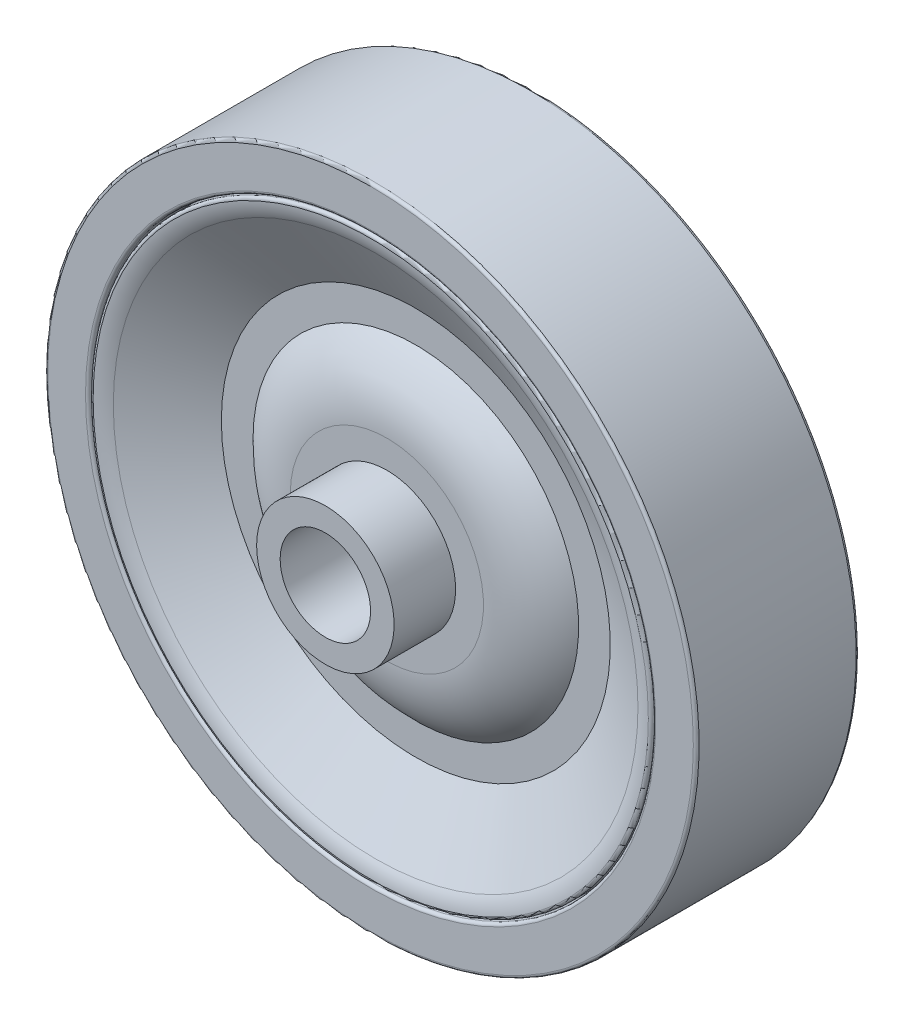
ISO-10303-21;
HEADER;
FILE_DESCRIPTION(('STEP AP214'),'2;1');
FILE_NAME('part.step','',(''),(''),'','','');
FILE_SCHEMA(('AUTOMOTIVE_DESIGN { 1 0 10303 214 1 1 1 1 }'));
ENDSEC;
DATA;
#1=APPLICATION_CONTEXT('core data for automotive mechanical design processes');
#2=APPLICATION_PROTOCOL_DEFINITION('international standard','automotive_design',2000,#1);
#3=PRODUCT_CONTEXT('',#1,'mechanical');
#4=PRODUCT('Part','Part','',(#3));
#5=PRODUCT_RELATED_PRODUCT_CATEGORY('part','',(#4));
#6=PRODUCT_DEFINITION_FORMATION('','',#4);
#7=PRODUCT_DEFINITION_CONTEXT('part definition',#1,'design');
#8=PRODUCT_DEFINITION('design','',#6,#7);
#9=PRODUCT_DEFINITION_SHAPE('','',#8);
#10=(LENGTH_UNIT() NAMED_UNIT(*) SI_UNIT(.MILLI.,.METRE.));
#11=(NAMED_UNIT(*) PLANE_ANGLE_UNIT() SI_UNIT($,.RADIAN.));
#12=(NAMED_UNIT(*) SI_UNIT($,.STERADIAN.) SOLID_ANGLE_UNIT());
#13=UNCERTAINTY_MEASURE_WITH_UNIT(LENGTH_MEASURE(1.E-05),#10,'distance_accuracy_value','');
#14=(GEOMETRIC_REPRESENTATION_CONTEXT(3) GLOBAL_UNCERTAINTY_ASSIGNED_CONTEXT((#13)) GLOBAL_UNIT_ASSIGNED_CONTEXT((#10,
#11,#12)) REPRESENTATION_CONTEXT('',''));
#15=CARTESIAN_POINT('',(0.,0.,0.));
#16=DIRECTION('',(0.,0.,1.));
#17=DIRECTION('',(1.,0.,0.));
#18=AXIS2_PLACEMENT_3D('',#15,#16,#17);
#19=CARTESIAN_POINT('',(0.,0.,-11.1125));
#20=DIRECTION('',(0.,0.,-1.));
#21=DIRECTION('',(-1.,0.,0.));
#22=AXIS2_PLACEMENT_3D('',#19,#20,#21);
#23=CYLINDRICAL_SURFACE('',#22,24.638);
#24=CARTESIAN_POINT('',(0.,0.,-6.87868556629696));
#25=DIRECTION('',(0.,0.,1.));
#26=DIRECTION('',(1.,0.,0.));
#27=AXIS2_PLACEMENT_3D('',#24,#25,#26);
#28=CIRCLE('',#27,24.638);
#29=CARTESIAN_POINT('',(24.638,0.,-6.87868556629696));
#30=VERTEX_POINT('',#29);
#31=EDGE_CURVE('E161',#30,#30,#28,.T.);
#32=ORIENTED_EDGE('',*,*,#31,.T.);
#33=EDGE_LOOP('',(#32));
#34=FACE_BOUND('',#33,.T.);
#35=CARTESIAN_POINT('',(0.,0.,6.87868556629696));
#36=DIRECTION('',(0.,0.,1.));
#37=DIRECTION('',(1.,0.,0.));
#38=AXIS2_PLACEMENT_3D('',#35,#36,#37);
#39=CIRCLE('',#38,24.638);
#40=CARTESIAN_POINT('',(24.638,0.,6.87868556629696));
#41=VERTEX_POINT('',#40);
#42=EDGE_CURVE('E55',#41,#41,#39,.T.);
#43=ORIENTED_EDGE('',*,*,#42,.F.);
#44=EDGE_LOOP('',(#43));
#45=FACE_BOUND('',#44,.T.);
#46=ADVANCED_FACE('F47',(#34,#45),#23,.T.);
#47=CARTESIAN_POINT('',(0.,0.,-3.96875));
#48=DIRECTION('',(0.,0.,-1.));
#49=DIRECTION('',(-1.,0.,0.));
#50=AXIS2_PLACEMENT_3D('',#47,#48,#49);
#51=TOROIDAL_SURFACE('',#50,24.638,3.175);
#52=CARTESIAN_POINT('',(0.,0.,-7.131723441629));
#53=DIRECTION('',(0.,0.,1.));
#54=DIRECTION('',(1.,0.,0.));
#55=AXIS2_PLACEMENT_3D('',#52,#53,#54);
#56=CIRCLE('',#55,24.3619130434781);
#57=CARTESIAN_POINT('',(24.3619130434781,0.,-7.131723441629));
#58=VERTEX_POINT('',#57);
#59=EDGE_CURVE('E158',#58,#58,#56,.F.);
#60=ORIENTED_EDGE('',*,*,#59,.T.);
#61=EDGE_LOOP('',(#60));
#62=FACE_BOUND('',#61,.T.);
#63=CARTESIAN_POINT('',(0.,0.,-6.70077389814638));
#64=DIRECTION('',(0.,0.,-1.));
#65=DIRECTION('',(-1.,0.,0.));
#66=AXIS2_PLACEMENT_3D('',#63,#64,#65);
#67=CIRCLE('',#66,23.0203874320601);
#68=CARTESIAN_POINT('',(-23.0203874320601,0.,-6.70077389814638));
#69=VERTEX_POINT('',#68);
#70=EDGE_CURVE('E155',#69,#69,#67,.T.);
#71=ORIENTED_EDGE('',*,*,#70,.F.);
#72=EDGE_LOOP('',(#71));
#73=FACE_BOUND('',#72,.T.);
#74=ADVANCED_FACE('F105',(#62,#73),#51,.T.);
#75=CARTESIAN_POINT('',(0.,0.,-3.17499999999999));
#76=DIRECTION('',(0.,0.,-1.));
#77=DIRECTION('',(-1.,0.,0.));
#78=AXIS2_PLACEMENT_3D('',#75,#76,#77);
#79=CONICAL_SURFACE('',#78,17.065625,1.03621099057237);
#80=ORIENTED_EDGE('',*,*,#70,.T.);
#81=EDGE_LOOP('',(#80));
#82=FACE_BOUND('',#81,.T.);
#83=CARTESIAN_POINT('',(0.,0.,-3.17499999999999));
#84=DIRECTION('',(0.,0.,-1.));
#85=DIRECTION('',(-1.,0.,0.));
#86=AXIS2_PLACEMENT_3D('',#83,#84,#85);
#87=CIRCLE('',#86,17.065625);
#88=CARTESIAN_POINT('',(-17.065625,0.,-3.17499999999999));
#89=VERTEX_POINT('',#88);
#90=EDGE_CURVE('E152',#89,#89,#87,.T.);
#91=ORIENTED_EDGE('',*,*,#90,.F.);
#92=EDGE_LOOP('',(#91));
#93=FACE_BOUND('',#92,.T.);
#94=ADVANCED_FACE('F111',(#82,#93),#79,.F.);
#95=CARTESIAN_POINT('',(0.,-14.2875,-3.17499999999999));
#96=DIRECTION('',(0.,0.,-1.));
#97=DIRECTION('',(-1.,0.,0.));
#98=AXIS2_PLACEMENT_3D('',#95,#96,#97);
#99=PLANE('',#98);
#100=ORIENTED_EDGE('',*,*,#90,.T.);
#101=EDGE_LOOP('',(#100));
#102=FACE_BOUND('',#101,.T.);
#103=CARTESIAN_POINT('',(0.,0.,-3.17499999999999));
#104=DIRECTION('',(0.,0.,-1.));
#105=DIRECTION('',(-1.,0.,0.));
#106=AXIS2_PLACEMENT_3D('',#103,#104,#105);
#107=CIRCLE('',#106,14.2875);
#108=CARTESIAN_POINT('',(-14.2875,0.,-3.17499999999999));
#109=VERTEX_POINT('',#108);
#110=EDGE_CURVE('E149',#109,#109,#107,.T.);
#111=ORIENTED_EDGE('',*,*,#110,.F.);
#112=EDGE_LOOP('',(#111));
#113=FACE_BOUND('',#112,.T.);
#114=ADVANCED_FACE('F119',(#102,#113),#99,.T.);
#115=CARTESIAN_POINT('',(0.,0.,2.20343118058775));
#116=DIRECTION('',(0.,0.,-1.));
#117=DIRECTION('',(-1.,0.,0.));
#118=AXIS2_PLACEMENT_3D('',#115,#116,#117);
#119=TOROIDAL_SURFACE('',#118,8.47595714139644,7.91843118058775);
#120=ORIENTED_EDGE('',*,*,#110,.T.);
#121=EDGE_LOOP('',(#120));
#122=FACE_BOUND('',#121,.T.);
#123=CARTESIAN_POINT('',(0.,0.,-5.715));
#124=DIRECTION('',(0.,0.,-1.));
#125=DIRECTION('',(-1.,0.,0.));
#126=AXIS2_PLACEMENT_3D('',#123,#124,#125);
#127=CIRCLE('',#126,8.47595714139644);
#128=CARTESIAN_POINT('',(-8.47595714139644,0.,-5.715));
#129=VERTEX_POINT('',#128);
#130=EDGE_CURVE('E144',#129,#129,#127,.T.);
#131=ORIENTED_EDGE('',*,*,#130,.F.);
#132=EDGE_LOOP('',(#131));
#133=FACE_BOUND('',#132,.T.);
#134=ADVANCED_FACE('F123',(#122,#133),#119,.T.);
#135=CARTESIAN_POINT('',(0.,-8.47595714139645,-5.715));
#136=DIRECTION('',(0.,0.,-1.));
#137=DIRECTION('',(-1.,0.,0.));
#138=AXIS2_PLACEMENT_3D('',#135,#136,#137);
#139=PLANE('',#138);
#140=ORIENTED_EDGE('',*,*,#130,.T.);
#141=EDGE_LOOP('',(#140));
#142=FACE_BOUND('',#141,.T.);
#143=CARTESIAN_POINT('',(0.,0.,-5.715));
#144=DIRECTION('',(0.,0.,-1.));
#145=DIRECTION('',(-1.,0.,0.));
#146=AXIS2_PLACEMENT_3D('',#143,#144,#145);
#147=CIRCLE('',#146,6.0325);
#148=CARTESIAN_POINT('',(-6.0325,0.,-5.715));
#149=VERTEX_POINT('',#148);
#150=EDGE_CURVE('E139',#149,#149,#147,.T.);
#151=ORIENTED_EDGE('',*,*,#150,.F.);
#152=EDGE_LOOP('',(#151));
#153=FACE_BOUND('',#152,.T.);
#154=ADVANCED_FACE('F127',(#142,#153),#139,.T.);
#155=CARTESIAN_POINT('',(0.,0.,-11.1125));
#156=DIRECTION('',(0.,0.,-1.));
#157=DIRECTION('',(-1.,0.,0.));
#158=AXIS2_PLACEMENT_3D('',#155,#156,#157);
#159=CYLINDRICAL_SURFACE('',#158,6.0325);
#160=ORIENTED_EDGE('',*,*,#150,.T.);
#161=EDGE_LOOP('',(#160));
#162=FACE_BOUND('',#161,.T.);
#163=CARTESIAN_POINT('',(0.,0.,-11.1125));
#164=DIRECTION('',(0.,0.,-1.));
#165=DIRECTION('',(-1.,0.,0.));
#166=AXIS2_PLACEMENT_3D('',#163,#164,#165);
#167=CIRCLE('',#166,6.0325);
#168=CARTESIAN_POINT('',(-6.0325,0.,-11.1125));
#169=VERTEX_POINT('',#168);
#170=EDGE_CURVE('E142',#169,#169,#167,.T.);
#171=ORIENTED_EDGE('',*,*,#170,.F.);
#172=EDGE_LOOP('',(#171));
#173=FACE_BOUND('',#172,.T.);
#174=ADVANCED_FACE('F99',(#162,#173),#159,.T.);
#175=CARTESIAN_POINT('',(0.,-3.96875,-11.1125));
#176=DIRECTION('',(0.,0.,-1.));
#177=DIRECTION('',(-1.,0.,0.));
#178=AXIS2_PLACEMENT_3D('',#175,#176,#177);
#179=PLANE('',#178);
#180=ORIENTED_EDGE('',*,*,#170,.T.);
#181=EDGE_LOOP('',(#180));
#182=FACE_BOUND('',#181,.T.);
#183=CARTESIAN_POINT('',(0.,0.,-11.1125));
#184=DIRECTION('',(0.,0.,-1.));
#185=DIRECTION('',(-1.,0.,0.));
#186=AXIS2_PLACEMENT_3D('',#183,#184,#185);
#187=CIRCLE('',#186,3.96875);
#188=CARTESIAN_POINT('',(-3.96875,0.,-11.1125));
#189=VERTEX_POINT('',#188);
#190=EDGE_CURVE('E67',#189,#189,#187,.T.);
#191=ORIENTED_EDGE('',*,*,#190,.F.);
#192=EDGE_LOOP('',(#191));
#193=FACE_BOUND('',#192,.T.);
#194=ADVANCED_FACE('F89',(#182,#193),#179,.T.);
#195=CARTESIAN_POINT('',(0.,0.,-11.1125));
#196=DIRECTION('',(0.,0.,-1.));
#197=DIRECTION('',(-1.,0.,0.));
#198=AXIS2_PLACEMENT_3D('',#195,#196,#197);
#199=CYLINDRICAL_SURFACE('',#198,3.96875);
#200=ORIENTED_EDGE('',*,*,#190,.T.);
#201=EDGE_LOOP('',(#200));
#202=FACE_BOUND('',#201,.T.);
#203=CARTESIAN_POINT('',(0.,0.,11.1125));
#204=DIRECTION('',(0.,0.,-1.));
#205=DIRECTION('',(-1.,0.,0.));
#206=AXIS2_PLACEMENT_3D('',#203,#204,#205);
#207=CIRCLE('',#206,3.96875);
#208=CARTESIAN_POINT('',(-3.96875,0.,11.1125));
#209=VERTEX_POINT('',#208);
#210=EDGE_CURVE('E51',#209,#209,#207,.T.);
#211=ORIENTED_EDGE('',*,*,#210,.F.);
#212=EDGE_LOOP('',(#211));
#213=FACE_BOUND('',#212,.T.);
#214=ADVANCED_FACE('F86',(#202,#213),#199,.F.);
#215=CARTESIAN_POINT('',(0.,0.,-6.87868556629696));
#216=DIRECTION('',(0.,0.,1.));
#217=DIRECTION('',(1.,0.,0.));
#218=AXIS2_PLACEMENT_3D('',#215,#216,#217);
#219=TOROIDAL_SURFACE('',#218,24.384,0.254);
#220=ORIENTED_EDGE('',*,*,#31,.F.);
#221=EDGE_LOOP('',(#220));
#222=FACE_BOUND('',#221,.T.);
#223=ORIENTED_EDGE('',*,*,#59,.F.);
#224=EDGE_LOOP('',(#223));
#225=FACE_BOUND('',#224,.T.);
#226=ADVANCED_FACE('F88',(#222,#225),#219,.T.);
#227=CARTESIAN_POINT('',(0.,0.,3.96875));
#228=DIRECTION('',(0.,0.,1.));
#229=DIRECTION('',(-1.,0.,0.));
#230=AXIS2_PLACEMENT_3D('',#227,#228,#229);
#231=TOROIDAL_SURFACE('',#230,24.638,3.175);
#232=CARTESIAN_POINT('',(0.,0.,7.131723441629));
#233=DIRECTION('',(0.,0.,1.));
#234=DIRECTION('',(1.,0.,0.));
#235=AXIS2_PLACEMENT_3D('',#232,#233,#234);
#236=CIRCLE('',#235,24.3619130434781);
#237=CARTESIAN_POINT('',(24.3619130434781,0.,7.131723441629));
#238=VERTEX_POINT('',#237);
#239=EDGE_CURVE('E11',#238,#238,#236,.F.);
#240=ORIENTED_EDGE('',*,*,#239,.F.);
#241=EDGE_LOOP('',(#240));
#242=FACE_BOUND('',#241,.T.);
#243=CARTESIAN_POINT('',(0.,0.,6.70077389814638));
#244=DIRECTION('',(0.,0.,-1.));
#245=DIRECTION('',(-1.,0.,0.));
#246=AXIS2_PLACEMENT_3D('',#243,#244,#245);
#247=CIRCLE('',#246,23.0203874320601);
#248=CARTESIAN_POINT('',(-23.0203874320601,0.,6.70077389814638));
#249=VERTEX_POINT('',#248);
#250=EDGE_CURVE('E63',#249,#249,#247,.T.);
#251=ORIENTED_EDGE('',*,*,#250,.T.);
#252=EDGE_LOOP('',(#251));
#253=FACE_BOUND('',#252,.T.);
#254=ADVANCED_FACE('F96',(#242,#253),#231,.T.);
#255=CARTESIAN_POINT('',(0.,0.,3.17499999999999));
#256=DIRECTION('',(0.,0.,1.));
#257=DIRECTION('',(-1.,0.,0.));
#258=AXIS2_PLACEMENT_3D('',#255,#256,#257);
#259=CONICAL_SURFACE('',#258,17.065625,1.03621099057237);
#260=ORIENTED_EDGE('',*,*,#250,.F.);
#261=EDGE_LOOP('',(#260));
#262=FACE_BOUND('',#261,.T.);
#263=CARTESIAN_POINT('',(0.,0.,3.17499999999999));
#264=DIRECTION('',(0.,0.,-1.));
#265=DIRECTION('',(-1.,0.,0.));
#266=AXIS2_PLACEMENT_3D('',#263,#264,#265);
#267=CIRCLE('',#266,17.065625);
#268=CARTESIAN_POINT('',(-17.065625,0.,3.17499999999999));
#269=VERTEX_POINT('',#268);
#270=EDGE_CURVE('E66',#269,#269,#267,.T.);
#271=ORIENTED_EDGE('',*,*,#270,.T.);
#272=EDGE_LOOP('',(#271));
#273=FACE_BOUND('',#272,.T.);
#274=ADVANCED_FACE('F198',(#262,#273),#259,.F.);
#275=CARTESIAN_POINT('',(0.,-14.2875,3.17499999999999));
#276=DIRECTION('',(0.,0.,1.));
#277=DIRECTION('',(-1.,0.,0.));
#278=AXIS2_PLACEMENT_3D('',#275,#276,#277);
#279=PLANE('',#278);
#280=ORIENTED_EDGE('',*,*,#270,.F.);
#281=EDGE_LOOP('',(#280));
#282=FACE_BOUND('',#281,.T.);
#283=CARTESIAN_POINT('',(0.,0.,3.17499999999999));
#284=DIRECTION('',(0.,0.,-1.));
#285=DIRECTION('',(-1.,0.,0.));
#286=AXIS2_PLACEMENT_3D('',#283,#284,#285);
#287=CIRCLE('',#286,14.2875);
#288=CARTESIAN_POINT('',(-14.2875,0.,3.17499999999999));
#289=VERTEX_POINT('',#288);
#290=EDGE_CURVE('E70',#289,#289,#287,.T.);
#291=ORIENTED_EDGE('',*,*,#290,.T.);
#292=EDGE_LOOP('',(#291));
#293=FACE_BOUND('',#292,.T.);
#294=ADVANCED_FACE('F206',(#282,#293),#279,.T.);
#295=CARTESIAN_POINT('',(0.,0.,-2.20343118058775));
#296=DIRECTION('',(0.,0.,1.));
#297=DIRECTION('',(-1.,0.,0.));
#298=AXIS2_PLACEMENT_3D('',#295,#296,#297);
#299=TOROIDAL_SURFACE('',#298,8.47595714139644,7.91843118058775);
#300=ORIENTED_EDGE('',*,*,#290,.F.);
#301=EDGE_LOOP('',(#300));
#302=FACE_BOUND('',#301,.T.);
#303=CARTESIAN_POINT('',(0.,0.,5.715));
#304=DIRECTION('',(0.,0.,-1.));
#305=DIRECTION('',(-1.,0.,0.));
#306=AXIS2_PLACEMENT_3D('',#303,#304,#305);
#307=CIRCLE('',#306,8.47595714139644);
#308=CARTESIAN_POINT('',(-8.47595714139644,0.,5.715));
#309=VERTEX_POINT('',#308);
#310=EDGE_CURVE('E73',#309,#309,#307,.T.);
#311=ORIENTED_EDGE('',*,*,#310,.T.);
#312=EDGE_LOOP('',(#311));
#313=FACE_BOUND('',#312,.T.);
#314=ADVANCED_FACE('F214',(#302,#313),#299,.T.);
#315=CARTESIAN_POINT('',(0.,-8.47595714139645,5.715));
#316=DIRECTION('',(0.,0.,1.));
#317=DIRECTION('',(-1.,0.,0.));
#318=AXIS2_PLACEMENT_3D('',#315,#316,#317);
#319=PLANE('',#318);
#320=ORIENTED_EDGE('',*,*,#310,.F.);
#321=EDGE_LOOP('',(#320));
#322=FACE_BOUND('',#321,.T.);
#323=CARTESIAN_POINT('',(0.,0.,5.715));
#324=DIRECTION('',(0.,0.,-1.));
#325=DIRECTION('',(-1.,0.,0.));
#326=AXIS2_PLACEMENT_3D('',#323,#324,#325);
#327=CIRCLE('',#326,6.0325);
#328=CARTESIAN_POINT('',(-6.0325,0.,5.715));
#329=VERTEX_POINT('',#328);
#330=EDGE_CURVE('E76',#329,#329,#327,.T.);
#331=ORIENTED_EDGE('',*,*,#330,.T.);
#332=EDGE_LOOP('',(#331));
#333=FACE_BOUND('',#332,.T.);
#334=ADVANCED_FACE('F222',(#322,#333),#319,.T.);
#335=CARTESIAN_POINT('',(0.,0.,11.1125));
#336=DIRECTION('',(0.,0.,1.));
#337=DIRECTION('',(-1.,0.,0.));
#338=AXIS2_PLACEMENT_3D('',#335,#336,#337);
#339=CYLINDRICAL_SURFACE('',#338,6.0325);
#340=ORIENTED_EDGE('',*,*,#330,.F.);
#341=EDGE_LOOP('',(#340));
#342=FACE_BOUND('',#341,.T.);
#343=CARTESIAN_POINT('',(0.,0.,11.1125));
#344=DIRECTION('',(0.,0.,-1.));
#345=DIRECTION('',(-1.,0.,0.));
#346=AXIS2_PLACEMENT_3D('',#343,#344,#345);
#347=CIRCLE('',#346,6.0325);
#348=CARTESIAN_POINT('',(-6.0325,0.,11.1125));
#349=VERTEX_POINT('',#348);
#350=EDGE_CURVE('E78',#349,#349,#347,.T.);
#351=ORIENTED_EDGE('',*,*,#350,.T.);
#352=EDGE_LOOP('',(#351));
#353=FACE_BOUND('',#352,.T.);
#354=ADVANCED_FACE('F230',(#342,#353),#339,.T.);
#355=CARTESIAN_POINT('',(0.,-3.96875,11.1125));
#356=DIRECTION('',(0.,0.,1.));
#357=DIRECTION('',(-1.,0.,0.));
#358=AXIS2_PLACEMENT_3D('',#355,#356,#357);
#359=PLANE('',#358);
#360=ORIENTED_EDGE('',*,*,#350,.F.);
#361=EDGE_LOOP('',(#360));
#362=FACE_BOUND('',#361,.T.);
#363=ORIENTED_EDGE('',*,*,#210,.T.);
#364=EDGE_LOOP('',(#363));
#365=FACE_BOUND('',#364,.T.);
#366=ADVANCED_FACE('F49',(#362,#365),#359,.T.);
#367=CARTESIAN_POINT('',(0.,0.,6.87868556629696));
#368=DIRECTION('',(0.,0.,-1.));
#369=DIRECTION('',(1.,0.,0.));
#370=AXIS2_PLACEMENT_3D('',#367,#368,#369);
#371=TOROIDAL_SURFACE('',#370,24.384,0.254);
#372=ORIENTED_EDGE('',*,*,#42,.T.);
#373=EDGE_LOOP('',(#372));
#374=FACE_BOUND('',#373,.T.);
#375=ORIENTED_EDGE('',*,*,#239,.T.);
#376=EDGE_LOOP('',(#375));
#377=FACE_BOUND('',#376,.T.);
#378=ADVANCED_FACE('F244',(#374,#377),#371,.T.);
#379=CLOSED_SHELL('',(#46,#74,#94,#114,#134,#154,#174,#194,#214,#226,#254,#274,#294,#314,#334,
#354,#366,#378));
#380=MANIFOLD_SOLID_BREP('B2',#379);
#381=CARTESIAN_POINT('',(0.,0.,-6.88975));
#382=DIRECTION('',(0.,0.,-1.));
#383=DIRECTION('',(-1.,0.,0.));
#384=AXIS2_PLACEMENT_3D('',#381,#382,#383);
#385=TOROIDAL_SURFACE('',#384,28.321,0.254);
#386=CARTESIAN_POINT('',(0.,0.,-6.88975));
#387=DIRECTION('',(0.,0.,-1.));
#388=DIRECTION('',(-1.,0.,0.));
#389=AXIS2_PLACEMENT_3D('',#386,#387,#388);
#390=CIRCLE('',#389,28.575);
#391=CARTESIAN_POINT('',(-28.575,0.,-6.88975));
#392=VERTEX_POINT('',#391);
#393=EDGE_CURVE('E299',#392,#392,#390,.F.);
#394=ORIENTED_EDGE('',*,*,#393,.F.);
#395=EDGE_LOOP('',(#394));
#396=FACE_BOUND('',#395,.T.);
#397=CARTESIAN_POINT('',(0.,0.,-7.14375));
#398=DIRECTION('',(0.,0.,-1.));
#399=DIRECTION('',(-1.,0.,0.));
#400=AXIS2_PLACEMENT_3D('',#397,#398,#399);
#401=CIRCLE('',#400,28.321);
#402=CARTESIAN_POINT('',(-28.321,0.,-7.14375));
#403=VERTEX_POINT('',#402);
#404=EDGE_CURVE('E303',#403,#403,#401,.T.);
#405=ORIENTED_EDGE('',*,*,#404,.F.);
#406=EDGE_LOOP('',(#405));
#407=FACE_BOUND('',#406,.T.);
#408=ADVANCED_FACE('F292',(#396,#407),#385,.T.);
#409=CARTESIAN_POINT('',(-1.99538158514885E-13,-28.575,-7.14375));
#410=DIRECTION('',(0.,0.,-1.));
#411=DIRECTION('',(-1.,0.,0.));
#412=AXIS2_PLACEMENT_3D('',#409,#410,#411);
#413=PLANE('',#412);
#414=ORIENTED_EDGE('',*,*,#404,.T.);
#415=EDGE_LOOP('',(#414));
#416=FACE_BOUND('',#415,.T.);
#417=CARTESIAN_POINT('',(0.,0.,-7.14375));
#418=DIRECTION('',(0.,0.,-1.));
#419=DIRECTION('',(-1.,0.,0.));
#420=AXIS2_PLACEMENT_3D('',#417,#418,#419);
#421=CIRCLE('',#420,25.019);
#422=CARTESIAN_POINT('',(-25.019,0.,-7.14375));
#423=VERTEX_POINT('',#422);
#424=EDGE_CURVE('E307',#423,#423,#421,.F.);
#425=ORIENTED_EDGE('',*,*,#424,.T.);
#426=EDGE_LOOP('',(#425));
#427=FACE_BOUND('',#426,.T.);
#428=ADVANCED_FACE('F344',(#416,#427),#413,.T.);
#429=CARTESIAN_POINT('',(0.,0.,-6.88975));
#430=DIRECTION('',(0.,0.,-1.));
#431=DIRECTION('',(-1.,0.,0.));
#432=AXIS2_PLACEMENT_3D('',#429,#430,#431);
#433=TOROIDAL_SURFACE('',#432,25.019,0.254);
#434=ORIENTED_EDGE('',*,*,#424,.F.);
#435=EDGE_LOOP('',(#434));
#436=FACE_BOUND('',#435,.T.);
#437=CARTESIAN_POINT('',(0.,0.,-6.88975));
#438=DIRECTION('',(0.,0.,-1.));
#439=DIRECTION('',(-1.,0.,0.));
#440=AXIS2_PLACEMENT_3D('',#437,#438,#439);
#441=CIRCLE('',#440,24.765);
#442=CARTESIAN_POINT('',(-24.765,0.,-6.88975));
#443=VERTEX_POINT('',#442);
#444=EDGE_CURVE('E46',#443,#443,#441,.T.);
#445=ORIENTED_EDGE('',*,*,#444,.F.);
#446=EDGE_LOOP('',(#445));
#447=FACE_BOUND('',#446,.T.);
#448=ADVANCED_FACE('F294',(#436,#447),#433,.T.);
#449=CARTESIAN_POINT('',(0.,0.,-11.1125));
#450=DIRECTION('',(0.,0.,-1.));
#451=DIRECTION('',(-1.,0.,0.));
#452=AXIS2_PLACEMENT_3D('',#449,#450,#451);
#453=CYLINDRICAL_SURFACE('',#452,24.765);
#454=ORIENTED_EDGE('',*,*,#444,.T.);
#455=EDGE_LOOP('',(#454));
#456=FACE_BOUND('',#455,.T.);
#457=CARTESIAN_POINT('',(0.,0.,6.88975));
#458=DIRECTION('',(0.,0.,-1.));
#459=DIRECTION('',(-1.,0.,0.));
#460=AXIS2_PLACEMENT_3D('',#457,#458,#459);
#461=CIRCLE('',#460,24.765);
#462=CARTESIAN_POINT('',(-24.765,0.,6.88975));
#463=VERTEX_POINT('',#462);
#464=EDGE_CURVE('E312',#463,#463,#461,.T.);
#465=ORIENTED_EDGE('',*,*,#464,.F.);
#466=EDGE_LOOP('',(#465));
#467=FACE_BOUND('',#466,.T.);
#468=ADVANCED_FACE('F355',(#456,#467),#453,.F.);
#469=CARTESIAN_POINT('',(0.,0.,-11.1125));
#470=DIRECTION('',(0.,0.,-1.));
#471=DIRECTION('',(-1.,0.,0.));
#472=AXIS2_PLACEMENT_3D('',#469,#470,#471);
#473=CYLINDRICAL_SURFACE('',#472,28.575);
#474=ORIENTED_EDGE('',*,*,#393,.T.);
#475=EDGE_LOOP('',(#474));
#476=FACE_BOUND('',#475,.T.);
#477=CARTESIAN_POINT('',(0.,0.,6.88975));
#478=DIRECTION('',(0.,0.,-1.));
#479=DIRECTION('',(-1.,0.,0.));
#480=AXIS2_PLACEMENT_3D('',#477,#478,#479);
#481=CIRCLE('',#480,28.575);
#482=CARTESIAN_POINT('',(-28.575,0.,6.88975));
#483=VERTEX_POINT('',#482);
#484=EDGE_CURVE('E315',#483,#483,#481,.F.);
#485=ORIENTED_EDGE('',*,*,#484,.F.);
#486=EDGE_LOOP('',(#485));
#487=FACE_BOUND('',#486,.T.);
#488=ADVANCED_FACE('F339',(#476,#487),#473,.T.);
#489=CARTESIAN_POINT('',(0.,0.,6.88975));
#490=DIRECTION('',(0.,0.,1.));
#491=DIRECTION('',(-1.,0.,0.));
#492=AXIS2_PLACEMENT_3D('',#489,#490,#491);
#493=TOROIDAL_SURFACE('',#492,28.321,0.254);
#494=ORIENTED_EDGE('',*,*,#484,.T.);
#495=EDGE_LOOP('',(#494));
#496=FACE_BOUND('',#495,.T.);
#497=CARTESIAN_POINT('',(0.,0.,7.14375));
#498=DIRECTION('',(0.,0.,-1.));
#499=DIRECTION('',(-1.,0.,0.));
#500=AXIS2_PLACEMENT_3D('',#497,#498,#499);
#501=CIRCLE('',#500,28.321);
#502=CARTESIAN_POINT('',(-28.321,0.,7.14375));
#503=VERTEX_POINT('',#502);
#504=EDGE_CURVE('E318',#503,#503,#501,.T.);
#505=ORIENTED_EDGE('',*,*,#504,.T.);
#506=EDGE_LOOP('',(#505));
#507=FACE_BOUND('',#506,.T.);
#508=ADVANCED_FACE('F330',(#496,#507),#493,.T.);
#509=CARTESIAN_POINT('',(-1.99538158514885E-13,-28.575,7.14375));
#510=DIRECTION('',(0.,0.,1.));
#511=DIRECTION('',(-1.,0.,0.));
#512=AXIS2_PLACEMENT_3D('',#509,#510,#511);
#513=PLANE('',#512);
#514=ORIENTED_EDGE('',*,*,#504,.F.);
#515=EDGE_LOOP('',(#514));
#516=FACE_BOUND('',#515,.T.);
#517=CARTESIAN_POINT('',(0.,0.,7.14375));
#518=DIRECTION('',(0.,0.,-1.));
#519=DIRECTION('',(-1.,0.,0.));
#520=AXIS2_PLACEMENT_3D('',#517,#518,#519);
#521=CIRCLE('',#520,25.019);
#522=CARTESIAN_POINT('',(-25.019,0.,7.14375));
#523=VERTEX_POINT('',#522);
#524=EDGE_CURVE('E321',#523,#523,#521,.F.);
#525=ORIENTED_EDGE('',*,*,#524,.F.);
#526=EDGE_LOOP('',(#525));
#527=FACE_BOUND('',#526,.T.);
#528=ADVANCED_FACE('F328',(#516,#527),#513,.T.);
#529=CARTESIAN_POINT('',(0.,0.,6.88975));
#530=DIRECTION('',(0.,0.,1.));
#531=DIRECTION('',(-1.,0.,0.));
#532=AXIS2_PLACEMENT_3D('',#529,#530,#531);
#533=TOROIDAL_SURFACE('',#532,25.019,0.254);
#534=ORIENTED_EDGE('',*,*,#524,.T.);
#535=EDGE_LOOP('',(#534));
#536=FACE_BOUND('',#535,.T.);
#537=ORIENTED_EDGE('',*,*,#464,.T.);
#538=EDGE_LOOP('',(#537));
#539=FACE_BOUND('',#538,.T.);
#540=ADVANCED_FACE('F325',(#536,#539),#533,.T.);
#541=CLOSED_SHELL('',(#408,#428,#448,#468,#488,#508,#528,#540));
#542=MANIFOLD_SOLID_BREP('B6',#541);
#543=ADVANCED_BREP_SHAPE_REPRESENTATION('',(#18,#380,#542),#14);
#544=SHAPE_DEFINITION_REPRESENTATION(#9,#543);
ENDSEC;
END-ISO-10303-21;
